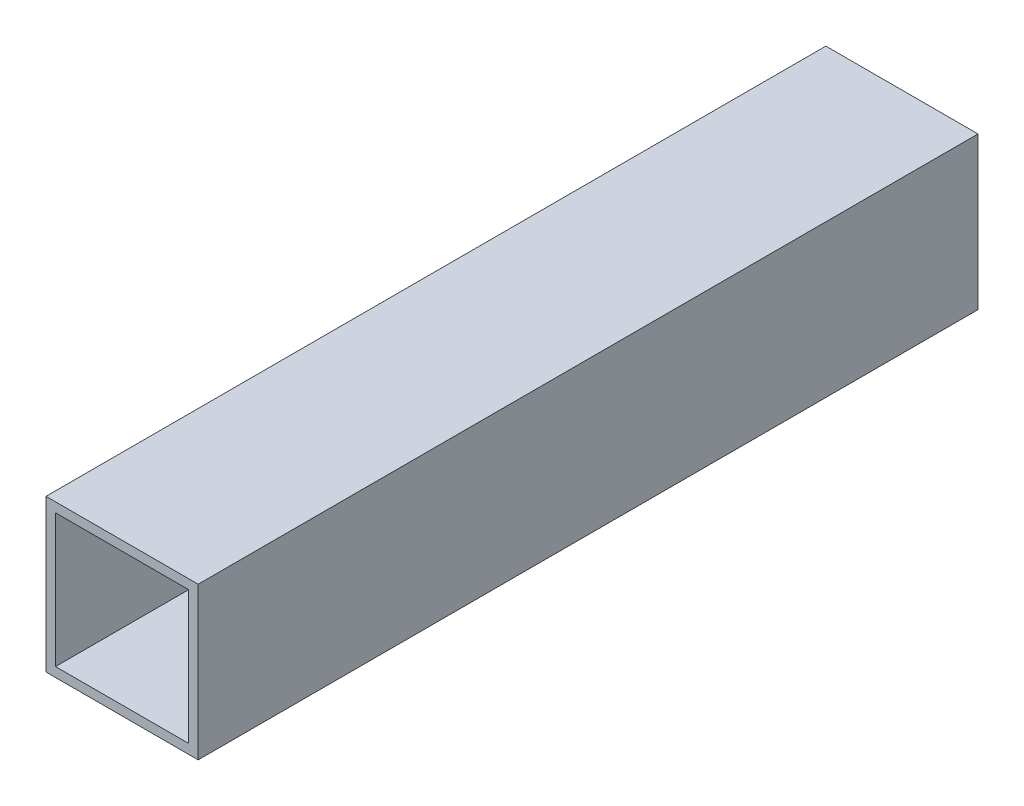
ISO-10303-21;
HEADER;
FILE_DESCRIPTION(('STEP AP214'),'2;1');
FILE_NAME('part.step','',(''),(''),'','','');
FILE_SCHEMA(('AUTOMOTIVE_DESIGN { 1 0 10303 214 1 1 1 1 }'));
ENDSEC;
DATA;
#1=APPLICATION_CONTEXT('core data for automotive mechanical design processes');
#2=APPLICATION_PROTOCOL_DEFINITION('international standard','automotive_design',2000,#1);
#3=PRODUCT_CONTEXT('',#1,'mechanical');
#4=PRODUCT('Part','Part','',(#3));
#5=PRODUCT_RELATED_PRODUCT_CATEGORY('part','',(#4));
#6=PRODUCT_DEFINITION_FORMATION('','',#4);
#7=PRODUCT_DEFINITION_CONTEXT('part definition',#1,'design');
#8=PRODUCT_DEFINITION('design','',#6,#7);
#9=PRODUCT_DEFINITION_SHAPE('','',#8);
#10=(LENGTH_UNIT() NAMED_UNIT(*) SI_UNIT(.MILLI.,.METRE.));
#11=(NAMED_UNIT(*) PLANE_ANGLE_UNIT() SI_UNIT($,.RADIAN.));
#12=(NAMED_UNIT(*) SI_UNIT($,.STERADIAN.) SOLID_ANGLE_UNIT());
#13=UNCERTAINTY_MEASURE_WITH_UNIT(LENGTH_MEASURE(1.E-05),#10,'distance_accuracy_value','');
#14=(GEOMETRIC_REPRESENTATION_CONTEXT(3) GLOBAL_UNCERTAINTY_ASSIGNED_CONTEXT((#13)) GLOBAL_UNIT_ASSIGNED_CONTEXT((#10,
#11,#12)) REPRESENTATION_CONTEXT('',''));
#15=CARTESIAN_POINT('',(0.,0.,0.));
#16=DIRECTION('',(0.,0.,1.));
#17=DIRECTION('',(1.,0.,0.));
#18=AXIS2_PLACEMENT_3D('',#15,#16,#17);
#19=CARTESIAN_POINT('',(0.,0.,260.35));
#20=DIRECTION('',(0.,0.,-1.));
#21=DIRECTION('',(-1.,0.,0.));
#22=AXIS2_PLACEMENT_3D('',#19,#20,#21);
#23=PLANE('',#22);
#24=DIRECTION('',(0.,1.,0.));
#25=VECTOR('',#24,1.);
#26=CARTESIAN_POINT('',(25.4,-25.4,260.35));
#27=LINE('',#26,#25);
#28=CARTESIAN_POINT('',(25.4,-25.4,260.35));
#29=VERTEX_POINT('',#28);
#30=CARTESIAN_POINT('',(25.4,25.4,260.35));
#31=VERTEX_POINT('',#30);
#32=EDGE_CURVE('E134',#29,#31,#27,.T.);
#33=ORIENTED_EDGE('',*,*,#32,.T.);
#34=DIRECTION('',(-1.,0.,0.));
#35=VECTOR('',#34,1.);
#36=CARTESIAN_POINT('',(-25.4,25.4,260.35));
#37=LINE('',#36,#35);
#38=CARTESIAN_POINT('',(-25.4,25.4,260.35));
#39=VERTEX_POINT('',#38);
#40=EDGE_CURVE('E137',#31,#39,#37,.T.);
#41=ORIENTED_EDGE('',*,*,#40,.T.);
#42=DIRECTION('',(0.,-1.,0.));
#43=VECTOR('',#42,1.);
#44=CARTESIAN_POINT('',(-25.4,-25.4,260.35));
#45=LINE('',#44,#43);
#46=CARTESIAN_POINT('',(-25.4,-25.4,260.35));
#47=VERTEX_POINT('',#46);
#48=EDGE_CURVE('E140',#39,#47,#45,.T.);
#49=ORIENTED_EDGE('',*,*,#48,.T.);
#50=DIRECTION('',(1.,0.,0.));
#51=VECTOR('',#50,1.);
#52=CARTESIAN_POINT('',(-25.4,-25.4,260.35));
#53=LINE('',#52,#51);
#54=EDGE_CURVE('E142',#47,#29,#53,.T.);
#55=ORIENTED_EDGE('',*,*,#54,.T.);
#56=EDGE_LOOP('',(#33,#41,#49,#55));
#57=FACE_BOUND('',#56,.T.);
#58=DIRECTION('',(0.,-1.,0.));
#59=VECTOR('',#58,1.);
#60=CARTESIAN_POINT('',(-22.225,-22.225,260.35));
#61=LINE('',#60,#59);
#62=CARTESIAN_POINT('',(-22.225,22.225,260.35));
#63=VERTEX_POINT('',#62);
#64=CARTESIAN_POINT('',(-22.225,-22.225,260.35));
#65=VERTEX_POINT('',#64);
#66=EDGE_CURVE('E98',#63,#65,#61,.T.);
#67=ORIENTED_EDGE('',*,*,#66,.F.);
#68=DIRECTION('',(-1.,0.,0.));
#69=VECTOR('',#68,1.);
#70=CARTESIAN_POINT('',(-22.225,22.225,260.35));
#71=LINE('',#70,#69);
#72=CARTESIAN_POINT('',(22.225,22.225,260.35));
#73=VERTEX_POINT('',#72);
#74=EDGE_CURVE('E120',#73,#63,#71,.T.);
#75=ORIENTED_EDGE('',*,*,#74,.F.);
#76=DIRECTION('',(0.,1.,0.));
#77=VECTOR('',#76,1.);
#78=CARTESIAN_POINT('',(22.225,-22.225,260.35));
#79=LINE('',#78,#77);
#80=CARTESIAN_POINT('',(22.225,-22.225,260.35));
#81=VERTEX_POINT('',#80);
#82=EDGE_CURVE('E118',#81,#73,#79,.T.);
#83=ORIENTED_EDGE('',*,*,#82,.F.);
#84=DIRECTION('',(1.,0.,0.));
#85=VECTOR('',#84,1.);
#86=CARTESIAN_POINT('',(-22.225,-22.225,260.35));
#87=LINE('',#86,#85);
#88=EDGE_CURVE('E106',#65,#81,#87,.T.);
#89=ORIENTED_EDGE('',*,*,#88,.F.);
#90=EDGE_LOOP('',(#67,#75,#83,#89));
#91=FACE_BOUND('',#90,.T.);
#92=ADVANCED_FACE('F33',(#57,#91),#23,.F.);
#93=CARTESIAN_POINT('',(0.,0.,0.));
#94=DIRECTION('',(0.,0.,-1.));
#95=DIRECTION('',(-1.,0.,0.));
#96=AXIS2_PLACEMENT_3D('',#93,#94,#95);
#97=PLANE('',#96);
#98=DIRECTION('',(0.,1.,0.));
#99=VECTOR('',#98,1.);
#100=CARTESIAN_POINT('',(25.4,-25.4,0.));
#101=LINE('',#100,#99);
#102=CARTESIAN_POINT('',(25.4,-25.4,0.));
#103=VERTEX_POINT('',#102);
#104=CARTESIAN_POINT('',(25.4,25.4,0.));
#105=VERTEX_POINT('',#104);
#106=EDGE_CURVE('E114',#103,#105,#101,.T.);
#107=ORIENTED_EDGE('',*,*,#106,.F.);
#108=DIRECTION('',(1.,0.,0.));
#109=VECTOR('',#108,1.);
#110=CARTESIAN_POINT('',(-25.4,-25.4,0.));
#111=LINE('',#110,#109);
#112=CARTESIAN_POINT('',(-25.4,-25.4,0.));
#113=VERTEX_POINT('',#112);
#114=EDGE_CURVE('E138',#113,#103,#111,.T.);
#115=ORIENTED_EDGE('',*,*,#114,.F.);
#116=DIRECTION('',(0.,-1.,0.));
#117=VECTOR('',#116,1.);
#118=CARTESIAN_POINT('',(-25.4,-25.4,0.));
#119=LINE('',#118,#117);
#120=CARTESIAN_POINT('',(-25.4,25.4,0.));
#121=VERTEX_POINT('',#120);
#122=EDGE_CURVE('E149',#121,#113,#119,.T.);
#123=ORIENTED_EDGE('',*,*,#122,.F.);
#124=DIRECTION('',(-1.,0.,0.));
#125=VECTOR('',#124,1.);
#126=CARTESIAN_POINT('',(-25.4,25.4,0.));
#127=LINE('',#126,#125);
#128=EDGE_CURVE('E147',#105,#121,#127,.T.);
#129=ORIENTED_EDGE('',*,*,#128,.F.);
#130=EDGE_LOOP('',(#107,#115,#123,#129));
#131=FACE_BOUND('',#130,.T.);
#132=DIRECTION('',(-1.,0.,0.));
#133=VECTOR('',#132,1.);
#134=CARTESIAN_POINT('',(-22.225,22.225,0.));
#135=LINE('',#134,#133);
#136=CARTESIAN_POINT('',(22.225,22.225,0.));
#137=VERTEX_POINT('',#136);
#138=CARTESIAN_POINT('',(-22.225,22.225,0.));
#139=VERTEX_POINT('',#138);
#140=EDGE_CURVE('E107',#137,#139,#135,.T.);
#141=ORIENTED_EDGE('',*,*,#140,.T.);
#142=DIRECTION('',(0.,-1.,0.));
#143=VECTOR('',#142,1.);
#144=CARTESIAN_POINT('',(-22.225,-22.225,0.));
#145=LINE('',#144,#143);
#146=CARTESIAN_POINT('',(-22.225,-22.225,0.));
#147=VERTEX_POINT('',#146);
#148=EDGE_CURVE('E56',#139,#147,#145,.T.);
#149=ORIENTED_EDGE('',*,*,#148,.T.);
#150=DIRECTION('',(1.,0.,0.));
#151=VECTOR('',#150,1.);
#152=CARTESIAN_POINT('',(-22.225,-22.225,0.));
#153=LINE('',#152,#151);
#154=CARTESIAN_POINT('',(22.225,-22.225,0.));
#155=VERTEX_POINT('',#154);
#156=EDGE_CURVE('E113',#147,#155,#153,.T.);
#157=ORIENTED_EDGE('',*,*,#156,.T.);
#158=DIRECTION('',(0.,1.,0.));
#159=VECTOR('',#158,1.);
#160=CARTESIAN_POINT('',(22.225,-22.225,0.));
#161=LINE('',#160,#159);
#162=EDGE_CURVE('E126',#155,#137,#161,.T.);
#163=ORIENTED_EDGE('',*,*,#162,.T.);
#164=EDGE_LOOP('',(#141,#149,#157,#163));
#165=FACE_BOUND('',#164,.T.);
#166=ADVANCED_FACE('F167',(#131,#165),#97,.T.);
#167=CARTESIAN_POINT('',(25.4,-25.4,260.35));
#168=DIRECTION('',(-1.,0.,0.));
#169=DIRECTION('',(0.,0.,1.));
#170=AXIS2_PLACEMENT_3D('',#167,#168,#169);
#171=PLANE('',#170);
#172=ORIENTED_EDGE('',*,*,#106,.T.);
#173=DIRECTION('',(0.,0.,-1.));
#174=VECTOR('',#173,1.);
#175=CARTESIAN_POINT('',(25.4,25.4,260.35));
#176=LINE('',#175,#174);
#177=EDGE_CURVE('E11',#31,#105,#176,.T.);
#178=ORIENTED_EDGE('',*,*,#177,.F.);
#179=ORIENTED_EDGE('',*,*,#32,.F.);
#180=DIRECTION('',(0.,0.,-1.));
#181=VECTOR('',#180,1.);
#182=CARTESIAN_POINT('',(25.4,-25.4,260.35));
#183=LINE('',#182,#181);
#184=EDGE_CURVE('E144',#29,#103,#183,.T.);
#185=ORIENTED_EDGE('',*,*,#184,.T.);
#186=EDGE_LOOP('',(#172,#178,#179,#185));
#187=FACE_BOUND('',#186,.T.);
#188=ADVANCED_FACE('F35',(#187),#171,.F.);
#189=CARTESIAN_POINT('',(-25.4,25.4,260.35));
#190=DIRECTION('',(0.,-1.,0.));
#191=DIRECTION('',(0.,0.,-1.));
#192=AXIS2_PLACEMENT_3D('',#189,#190,#191);
#193=PLANE('',#192);
#194=ORIENTED_EDGE('',*,*,#128,.T.);
#195=DIRECTION('',(0.,0.,-1.));
#196=VECTOR('',#195,1.);
#197=CARTESIAN_POINT('',(-25.4,25.4,260.35));
#198=LINE('',#197,#196);
#199=EDGE_CURVE('E41',#39,#121,#198,.T.);
#200=ORIENTED_EDGE('',*,*,#199,.F.);
#201=ORIENTED_EDGE('',*,*,#40,.F.);
#202=ORIENTED_EDGE('',*,*,#177,.T.);
#203=EDGE_LOOP('',(#194,#200,#201,#202));
#204=FACE_BOUND('',#203,.T.);
#205=ADVANCED_FACE('F177',(#204),#193,.F.);
#206=CARTESIAN_POINT('',(-25.4,-25.4,260.35));
#207=DIRECTION('',(1.,0.,0.));
#208=DIRECTION('',(0.,0.,-1.));
#209=AXIS2_PLACEMENT_3D('',#206,#207,#208);
#210=PLANE('',#209);
#211=ORIENTED_EDGE('',*,*,#122,.T.);
#212=DIRECTION('',(0.,0.,-1.));
#213=VECTOR('',#212,1.);
#214=CARTESIAN_POINT('',(-25.4,-25.4,260.35));
#215=LINE('',#214,#213);
#216=EDGE_CURVE('E154',#47,#113,#215,.T.);
#217=ORIENTED_EDGE('',*,*,#216,.F.);
#218=ORIENTED_EDGE('',*,*,#48,.F.);
#219=ORIENTED_EDGE('',*,*,#199,.T.);
#220=EDGE_LOOP('',(#211,#217,#218,#219));
#221=FACE_BOUND('',#220,.T.);
#222=ADVANCED_FACE('F161',(#221),#210,.F.);
#223=CARTESIAN_POINT('',(-25.4,-25.4,260.35));
#224=DIRECTION('',(0.,1.,0.));
#225=DIRECTION('',(0.,0.,1.));
#226=AXIS2_PLACEMENT_3D('',#223,#224,#225);
#227=PLANE('',#226);
#228=ORIENTED_EDGE('',*,*,#114,.T.);
#229=ORIENTED_EDGE('',*,*,#184,.F.);
#230=ORIENTED_EDGE('',*,*,#54,.F.);
#231=ORIENTED_EDGE('',*,*,#216,.T.);
#232=EDGE_LOOP('',(#228,#229,#230,#231));
#233=FACE_BOUND('',#232,.T.);
#234=ADVANCED_FACE('F171',(#233),#227,.F.);
#235=CARTESIAN_POINT('',(-22.225,-22.225,260.35));
#236=DIRECTION('',(1.,0.,0.));
#237=DIRECTION('',(0.,0.,-1.));
#238=AXIS2_PLACEMENT_3D('',#235,#236,#237);
#239=PLANE('',#238);
#240=ORIENTED_EDGE('',*,*,#148,.F.);
#241=DIRECTION('',(0.,0.,-1.));
#242=VECTOR('',#241,1.);
#243=CARTESIAN_POINT('',(-22.225,22.225,260.35));
#244=LINE('',#243,#242);
#245=EDGE_CURVE('E102',#63,#139,#244,.T.);
#246=ORIENTED_EDGE('',*,*,#245,.F.);
#247=ORIENTED_EDGE('',*,*,#66,.T.);
#248=DIRECTION('',(0.,0.,-1.));
#249=VECTOR('',#248,1.);
#250=CARTESIAN_POINT('',(-22.225,-22.225,260.35));
#251=LINE('',#250,#249);
#252=EDGE_CURVE('E101',#65,#147,#251,.T.);
#253=ORIENTED_EDGE('',*,*,#252,.T.);
#254=EDGE_LOOP('',(#240,#246,#247,#253));
#255=FACE_BOUND('',#254,.T.);
#256=ADVANCED_FACE('F100',(#255),#239,.T.);
#257=CARTESIAN_POINT('',(-22.225,-22.225,260.35));
#258=DIRECTION('',(0.,1.,0.));
#259=DIRECTION('',(0.,0.,1.));
#260=AXIS2_PLACEMENT_3D('',#257,#258,#259);
#261=PLANE('',#260);
#262=ORIENTED_EDGE('',*,*,#156,.F.);
#263=ORIENTED_EDGE('',*,*,#252,.F.);
#264=ORIENTED_EDGE('',*,*,#88,.T.);
#265=DIRECTION('',(0.,0.,-1.));
#266=VECTOR('',#265,1.);
#267=CARTESIAN_POINT('',(22.225,-22.225,260.35));
#268=LINE('',#267,#266);
#269=EDGE_CURVE('E115',#81,#155,#268,.T.);
#270=ORIENTED_EDGE('',*,*,#269,.T.);
#271=EDGE_LOOP('',(#262,#263,#264,#270));
#272=FACE_BOUND('',#271,.T.);
#273=ADVANCED_FACE('F110',(#272),#261,.T.);
#274=CARTESIAN_POINT('',(22.225,-22.225,260.35));
#275=DIRECTION('',(-1.,0.,0.));
#276=DIRECTION('',(0.,-1.,0.));
#277=AXIS2_PLACEMENT_3D('',#274,#275,#276);
#278=PLANE('',#277);
#279=ORIENTED_EDGE('',*,*,#162,.F.);
#280=ORIENTED_EDGE('',*,*,#269,.F.);
#281=ORIENTED_EDGE('',*,*,#82,.T.);
#282=DIRECTION('',(0.,0.,-1.));
#283=VECTOR('',#282,1.);
#284=CARTESIAN_POINT('',(22.225,22.225,260.35));
#285=LINE('',#284,#283);
#286=EDGE_CURVE('E48',#73,#137,#285,.T.);
#287=ORIENTED_EDGE('',*,*,#286,.T.);
#288=EDGE_LOOP('',(#279,#280,#281,#287));
#289=FACE_BOUND('',#288,.T.);
#290=ADVANCED_FACE('F200',(#289),#278,.T.);
#291=CARTESIAN_POINT('',(-22.225,22.225,260.35));
#292=DIRECTION('',(0.,-1.,0.));
#293=DIRECTION('',(1.,0.,0.));
#294=AXIS2_PLACEMENT_3D('',#291,#292,#293);
#295=PLANE('',#294);
#296=ORIENTED_EDGE('',*,*,#140,.F.);
#297=ORIENTED_EDGE('',*,*,#286,.F.);
#298=ORIENTED_EDGE('',*,*,#74,.T.);
#299=ORIENTED_EDGE('',*,*,#245,.T.);
#300=EDGE_LOOP('',(#296,#297,#298,#299));
#301=FACE_BOUND('',#300,.T.);
#302=ADVANCED_FACE('F204',(#301),#295,.T.);
#303=CLOSED_SHELL('',(#92,#166,#188,#205,#222,#234,#256,#273,#290,#302));
#304=MANIFOLD_SOLID_BREP('B2',#303);
#305=ADVANCED_BREP_SHAPE_REPRESENTATION('',(#18,#304),#14);
#306=SHAPE_DEFINITION_REPRESENTATION(#9,#305);
ENDSEC;
END-ISO-10303-21;
